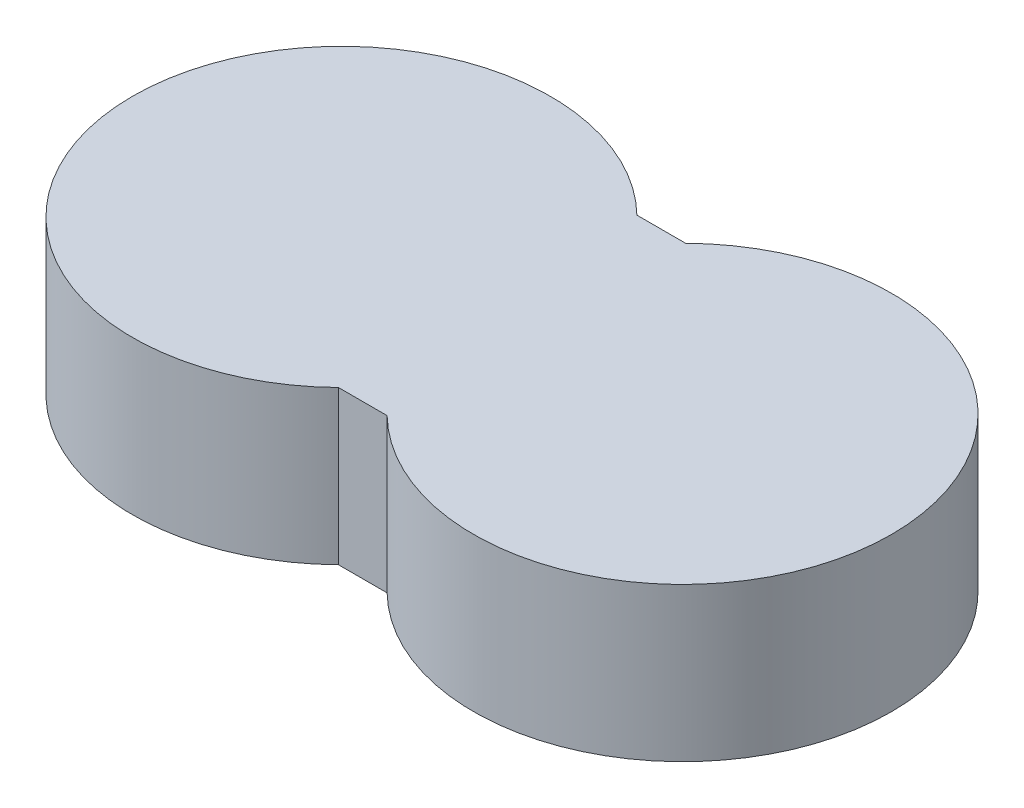
ISO-10303-21;
HEADER;
FILE_DESCRIPTION(('STEP AP214'),'2;1');
FILE_NAME('part.step','',(''),(''),'','','');
FILE_SCHEMA(('AUTOMOTIVE_DESIGN { 1 0 10303 214 1 1 1 1 }'));
ENDSEC;
DATA;
#1=APPLICATION_CONTEXT('core data for automotive mechanical design processes');
#2=APPLICATION_PROTOCOL_DEFINITION('international standard','automotive_design',2000,#1);
#3=PRODUCT_CONTEXT('',#1,'mechanical');
#4=PRODUCT('Part','Part','',(#3));
#5=PRODUCT_RELATED_PRODUCT_CATEGORY('part','',(#4));
#6=PRODUCT_DEFINITION_FORMATION('','',#4);
#7=PRODUCT_DEFINITION_CONTEXT('part definition',#1,'design');
#8=PRODUCT_DEFINITION('design','',#6,#7);
#9=PRODUCT_DEFINITION_SHAPE('','',#8);
#10=(LENGTH_UNIT() NAMED_UNIT(*) SI_UNIT(.MILLI.,.METRE.));
#11=(NAMED_UNIT(*) PLANE_ANGLE_UNIT() SI_UNIT($,.RADIAN.));
#12=(NAMED_UNIT(*) SI_UNIT($,.STERADIAN.) SOLID_ANGLE_UNIT());
#13=UNCERTAINTY_MEASURE_WITH_UNIT(LENGTH_MEASURE(1.E-05),#10,'distance_accuracy_value','');
#14=(GEOMETRIC_REPRESENTATION_CONTEXT(3) GLOBAL_UNCERTAINTY_ASSIGNED_CONTEXT((#13)) GLOBAL_UNIT_ASSIGNED_CONTEXT((#10,
#11,#12)) REPRESENTATION_CONTEXT('',''));
#15=CARTESIAN_POINT('',(0.,0.,0.));
#16=DIRECTION('',(0.,0.,1.));
#17=DIRECTION('',(1.,0.,0.));
#18=AXIS2_PLACEMENT_3D('',#15,#16,#17);
#19=CARTESIAN_POINT('',(-2.,1.8,0.));
#20=DIRECTION('',(0.,-1.,0.));
#21=DIRECTION('',(0.,0.,-1.));
#22=AXIS2_PLACEMENT_3D('',#19,#20,#21);
#23=CYLINDRICAL_SURFACE('',#22,2.45);
#24=CARTESIAN_POINT('',(-2.,0.,0.));
#25=DIRECTION('',(0.,1.,0.));
#26=DIRECTION('',(0.,0.,1.));
#27=AXIS2_PLACEMENT_3D('',#24,#25,#26);
#28=CIRCLE('',#27,2.45);
#29=CARTESIAN_POINT('',(-0.285357180051777,0.,-1.75));
#30=VERTEX_POINT('',#29);
#31=CARTESIAN_POINT('',(-0.285357180051776,0.,1.75));
#32=VERTEX_POINT('',#31);
#33=EDGE_CURVE('E104',#30,#32,#28,.T.);
#34=ORIENTED_EDGE('',*,*,#33,.T.);
#35=DIRECTION('',(0.,-1.,0.));
#36=VECTOR('',#35,1.);
#37=CARTESIAN_POINT('',(-0.285357180051776,1.8,1.75));
#38=LINE('',#37,#36);
#39=CARTESIAN_POINT('',(-0.285357180051776,1.8,1.75));
#40=VERTEX_POINT('',#39);
#41=EDGE_CURVE('E11',#40,#32,#38,.T.);
#42=ORIENTED_EDGE('',*,*,#41,.F.);
#43=CARTESIAN_POINT('',(-2.,1.8,0.));
#44=DIRECTION('',(0.,1.,0.));
#45=DIRECTION('',(0.,0.,1.));
#46=AXIS2_PLACEMENT_3D('',#43,#44,#45);
#47=CIRCLE('',#46,2.45);
#48=CARTESIAN_POINT('',(-0.285357180051777,1.8,-1.75));
#49=VERTEX_POINT('',#48);
#50=EDGE_CURVE('E90',#49,#40,#47,.T.);
#51=ORIENTED_EDGE('',*,*,#50,.F.);
#52=DIRECTION('',(0.,-1.,0.));
#53=VECTOR('',#52,1.);
#54=CARTESIAN_POINT('',(-0.285357180051777,1.8,-1.75));
#55=LINE('',#54,#53);
#56=EDGE_CURVE('E57',#49,#30,#55,.T.);
#57=ORIENTED_EDGE('',*,*,#56,.T.);
#58=EDGE_LOOP('',(#34,#42,#51,#57));
#59=FACE_BOUND('',#58,.T.);
#60=ADVANCED_FACE('F41',(#59),#23,.T.);
#61=CARTESIAN_POINT('',(0.,1.8,1.75));
#62=DIRECTION('',(0.,0.,-1.));
#63=DIRECTION('',(-1.,0.,0.));
#64=AXIS2_PLACEMENT_3D('',#61,#62,#63);
#65=PLANE('',#64);
#66=DIRECTION('',(1.,0.,0.));
#67=VECTOR('',#66,1.);
#68=CARTESIAN_POINT('',(0.,0.,1.75));
#69=LINE('',#68,#67);
#70=CARTESIAN_POINT('',(0.285357180051775,0.,1.75));
#71=VERTEX_POINT('',#70);
#72=EDGE_CURVE('E95',#32,#71,#69,.T.);
#73=ORIENTED_EDGE('',*,*,#72,.T.);
#74=DIRECTION('',(0.,-1.,0.));
#75=VECTOR('',#74,1.);
#76=CARTESIAN_POINT('',(0.285357180051775,1.8,1.75));
#77=LINE('',#76,#75);
#78=CARTESIAN_POINT('',(0.285357180051775,1.8,1.75));
#79=VERTEX_POINT('',#78);
#80=EDGE_CURVE('E49',#79,#71,#77,.T.);
#81=ORIENTED_EDGE('',*,*,#80,.F.);
#82=DIRECTION('',(1.,0.,0.));
#83=VECTOR('',#82,1.);
#84=CARTESIAN_POINT('',(0.,1.8,1.75));
#85=LINE('',#84,#83);
#86=EDGE_CURVE('E83',#40,#79,#85,.T.);
#87=ORIENTED_EDGE('',*,*,#86,.F.);
#88=ORIENTED_EDGE('',*,*,#41,.T.);
#89=EDGE_LOOP('',(#73,#81,#87,#88));
#90=FACE_BOUND('',#89,.T.);
#91=ADVANCED_FACE('F94',(#90),#65,.F.);
#92=CARTESIAN_POINT('',(2.,1.8,0.));
#93=DIRECTION('',(0.,-1.,0.));
#94=DIRECTION('',(0.,0.,-1.));
#95=AXIS2_PLACEMENT_3D('',#92,#93,#94);
#96=CYLINDRICAL_SURFACE('',#95,2.45);
#97=CARTESIAN_POINT('',(2.,0.,0.));
#98=DIRECTION('',(0.,1.,0.));
#99=DIRECTION('',(0.,0.,1.));
#100=AXIS2_PLACEMENT_3D('',#97,#98,#99);
#101=CIRCLE('',#100,2.45);
#102=CARTESIAN_POINT('',(0.285357180051777,0.,-1.75));
#103=VERTEX_POINT('',#102);
#104=EDGE_CURVE('E107',#71,#103,#101,.T.);
#105=ORIENTED_EDGE('',*,*,#104,.T.);
#106=DIRECTION('',(0.,-1.,0.));
#107=VECTOR('',#106,1.);
#108=CARTESIAN_POINT('',(0.285357180051777,1.8,-1.75));
#109=LINE('',#108,#107);
#110=CARTESIAN_POINT('',(0.285357180051777,1.8,-1.75));
#111=VERTEX_POINT('',#110);
#112=EDGE_CURVE('E72',#111,#103,#109,.T.);
#113=ORIENTED_EDGE('',*,*,#112,.F.);
#114=CARTESIAN_POINT('',(2.,1.8,0.));
#115=DIRECTION('',(0.,1.,0.));
#116=DIRECTION('',(0.,0.,1.));
#117=AXIS2_PLACEMENT_3D('',#114,#115,#116);
#118=CIRCLE('',#117,2.45);
#119=EDGE_CURVE('E89',#79,#111,#118,.T.);
#120=ORIENTED_EDGE('',*,*,#119,.F.);
#121=ORIENTED_EDGE('',*,*,#80,.T.);
#122=EDGE_LOOP('',(#105,#113,#120,#121));
#123=FACE_BOUND('',#122,.T.);
#124=ADVANCED_FACE('F98',(#123),#96,.T.);
#125=CARTESIAN_POINT('',(0.,1.8,-1.75));
#126=DIRECTION('',(0.,0.,-1.));
#127=DIRECTION('',(-1.,0.,0.));
#128=AXIS2_PLACEMENT_3D('',#125,#126,#127);
#129=PLANE('',#128);
#130=DIRECTION('',(1.,0.,0.));
#131=VECTOR('',#130,1.);
#132=CARTESIAN_POINT('',(0.,0.,-1.75));
#133=LINE('',#132,#131);
#134=EDGE_CURVE('E109',#30,#103,#133,.T.);
#135=ORIENTED_EDGE('',*,*,#134,.F.);
#136=ORIENTED_EDGE('',*,*,#56,.F.);
#137=DIRECTION('',(1.,0.,0.));
#138=VECTOR('',#137,1.);
#139=CARTESIAN_POINT('',(0.,1.8,-1.75));
#140=LINE('',#139,#138);
#141=EDGE_CURVE('E99',#49,#111,#140,.T.);
#142=ORIENTED_EDGE('',*,*,#141,.T.);
#143=ORIENTED_EDGE('',*,*,#112,.T.);
#144=EDGE_LOOP('',(#135,#136,#142,#143));
#145=FACE_BOUND('',#144,.T.);
#146=ADVANCED_FACE('F115',(#145),#129,.T.);
#147=CARTESIAN_POINT('',(0.,1.8,0.));
#148=DIRECTION('',(0.,1.,0.));
#149=DIRECTION('',(0.,0.,1.));
#150=AXIS2_PLACEMENT_3D('',#147,#148,#149);
#151=PLANE('',#150);
#152=ORIENTED_EDGE('',*,*,#50,.T.);
#153=ORIENTED_EDGE('',*,*,#86,.T.);
#154=ORIENTED_EDGE('',*,*,#119,.T.);
#155=ORIENTED_EDGE('',*,*,#141,.F.);
#156=EDGE_LOOP('',(#152,#153,#154,#155));
#157=FACE_BOUND('',#156,.T.);
#158=ADVANCED_FACE('F86',(#157),#151,.T.);
#159=CARTESIAN_POINT('',(0.,0.,0.));
#160=DIRECTION('',(0.,1.,0.));
#161=DIRECTION('',(0.,0.,1.));
#162=AXIS2_PLACEMENT_3D('',#159,#160,#161);
#163=PLANE('',#162);
#164=ORIENTED_EDGE('',*,*,#33,.F.);
#165=ORIENTED_EDGE('',*,*,#134,.T.);
#166=ORIENTED_EDGE('',*,*,#104,.F.);
#167=ORIENTED_EDGE('',*,*,#72,.F.);
#168=EDGE_LOOP('',(#164,#165,#166,#167));
#169=FACE_BOUND('',#168,.T.);
#170=ADVANCED_FACE('F114',(#169),#163,.F.);
#171=CLOSED_SHELL('',(#60,#91,#124,#146,#158,#170));
#172=MANIFOLD_SOLID_BREP('B2',#171);
#173=ADVANCED_BREP_SHAPE_REPRESENTATION('',(#18,#172),#14);
#174=SHAPE_DEFINITION_REPRESENTATION(#9,#173);
ENDSEC;
END-ISO-10303-21;
